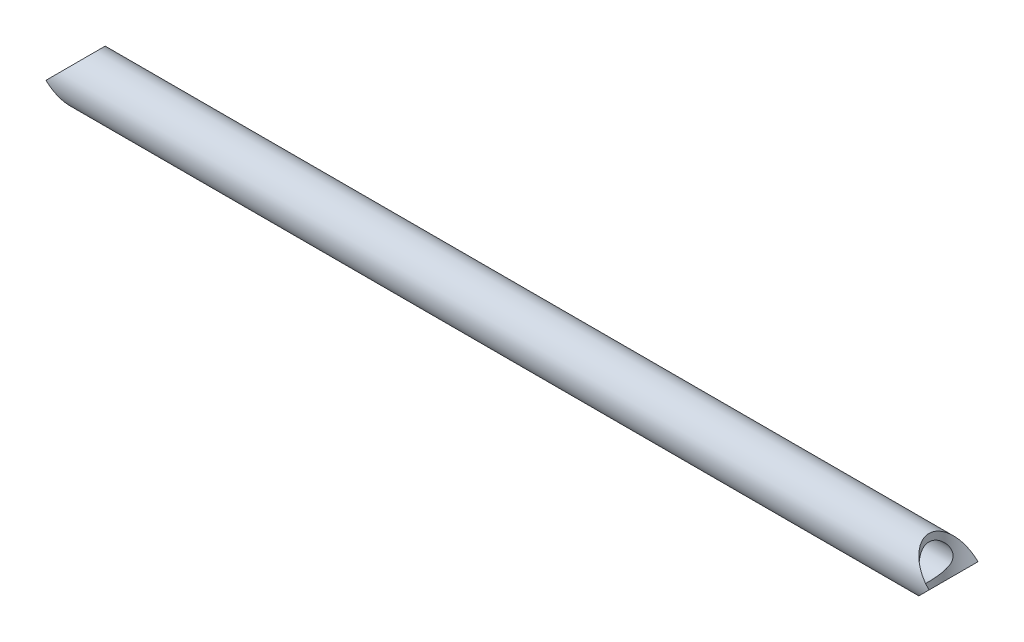
ISO-10303-21;
HEADER;
FILE_DESCRIPTION(('STEP AP214'),'2;1');
FILE_NAME('part.step','',(''),(''),'','','');
FILE_SCHEMA(('AUTOMOTIVE_DESIGN { 1 0 10303 214 1 1 1 1 }'));
ENDSEC;
DATA;
#1=APPLICATION_CONTEXT('core data for automotive mechanical design processes');
#2=APPLICATION_PROTOCOL_DEFINITION('international standard','automotive_design',2000,#1);
#3=PRODUCT_CONTEXT('',#1,'mechanical');
#4=PRODUCT('Part','Part','',(#3));
#5=PRODUCT_RELATED_PRODUCT_CATEGORY('part','',(#4));
#6=PRODUCT_DEFINITION_FORMATION('','',#4);
#7=PRODUCT_DEFINITION_CONTEXT('part definition',#1,'design');
#8=PRODUCT_DEFINITION('design','',#6,#7);
#9=PRODUCT_DEFINITION_SHAPE('','',#8);
#10=(LENGTH_UNIT() NAMED_UNIT(*) SI_UNIT(.MILLI.,.METRE.));
#11=(NAMED_UNIT(*) PLANE_ANGLE_UNIT() SI_UNIT($,.RADIAN.));
#12=(NAMED_UNIT(*) SI_UNIT($,.STERADIAN.) SOLID_ANGLE_UNIT());
#13=UNCERTAINTY_MEASURE_WITH_UNIT(LENGTH_MEASURE(1.E-05),#10,'distance_accuracy_value','');
#14=(GEOMETRIC_REPRESENTATION_CONTEXT(3) GLOBAL_UNCERTAINTY_ASSIGNED_CONTEXT((#13)) GLOBAL_UNIT_ASSIGNED_CONTEXT((#10,
#11,#12)) REPRESENTATION_CONTEXT('',''));
#15=CARTESIAN_POINT('',(0.,0.,0.));
#16=DIRECTION('',(0.,0.,1.));
#17=DIRECTION('',(1.,0.,0.));
#18=AXIS2_PLACEMENT_3D('',#15,#16,#17);
#19=CARTESIAN_POINT('',(900.,0.,-1.66533453693773E-13));
#20=DIRECTION('',(-1.,0.,0.));
#21=DIRECTION('',(0.,0.,1.));
#22=AXIS2_PLACEMENT_3D('',#19,#20,#21);
#23=CYLINDRICAL_SURFACE('',#22,35.);
#24=CARTESIAN_POINT('',(864.292857857286,0.,34.9999999999999));
#25=CARTESIAN_POINT('',(864.292849303966,-0.840107969640403,34.9999953725349));
#26=CARTESIAN_POINT('',(864.263065196487,-1.68027595587626,34.9696838888614));
#27=CARTESIAN_POINT('',(864.145552805204,-3.35221612686096,34.849181924876));
#28=CARTESIAN_POINT('',(864.057817160069,-4.1839872313608,34.7589838374223));
#29=CARTESIAN_POINT('',(863.828770631147,-5.83320919168845,34.5205642195379));
#30=CARTESIAN_POINT('',(863.687357448896,-6.65062956617839,34.3722318793914));
#31=CARTESIAN_POINT('',(863.357601126434,-8.26372825663242,34.0204719036503));
#32=CARTESIAN_POINT('',(863.169256074863,-9.05940568562161,33.8170420241068));
#33=CARTESIAN_POINT('',(862.755611040951,-10.6160962668867,33.360891138029));
#34=CARTESIAN_POINT('',(862.530752663306,-11.377399510945,33.108753050374));
#35=CARTESIAN_POINT('',(862.0501087885,-12.8722697515329,32.5567138302994));
#36=CARTESIAN_POINT('',(861.794323906225,-13.6058372991278,32.2568136474562));
#37=CARTESIAN_POINT('',(861.258988057873,-15.0436443658859,31.61185786152));
#38=CARTESIAN_POINT('',(860.979440076077,-15.7478875512387,31.2668079256175));
#39=CARTESIAN_POINT('',(860.403091712251,-17.1262102767459,30.5336264742112));
#40=CARTESIAN_POINT('',(860.106290094963,-17.8002876510772,30.1454918722867));
#41=CARTESIAN_POINT('',(859.448390250731,-19.2329409336998,29.256178437403));
#42=CARTESIAN_POINT('',(859.085135925753,-19.9856365330461,28.7471070972687));
#43=CARTESIAN_POINT('',(858.35172101799,-21.4471112794062,27.6738766652286));
#44=CARTESIAN_POINT('',(857.981559922528,-22.1558871493288,27.109713470689));
#45=CARTESIAN_POINT('',(857.241765906697,-23.5287326231606,25.9272125065642));
#46=CARTESIAN_POINT('',(856.872134115223,-24.1927488103879,25.3088119653037));
#47=CARTESIAN_POINT('',(856.141149569898,-25.4730222520026,24.0197921583747));
#48=CARTESIAN_POINT('',(855.779797389025,-26.0892762080667,23.3491692927812));
#49=CARTESIAN_POINT('',(855.013271415357,-27.3698937944522,21.8408769297572));
#50=CARTESIAN_POINT('',(854.610845068793,-28.0251298541144,20.9940046961305));
#51=CARTESIAN_POINT('',(853.837416608584,-29.261175575932,19.2338365369211));
#52=CARTESIAN_POINT('',(853.466420290707,-29.8419715212443,18.3205284178717));
#53=CARTESIAN_POINT('',(852.766866175359,-30.9214761037239,16.4329381599958));
#54=CARTESIAN_POINT('',(852.438240249569,-31.4203168818842,15.458757741131));
#55=CARTESIAN_POINT('',(851.984346648952,-32.1018921667805,13.9560498011595));
#56=CARTESIAN_POINT('',(851.839559125694,-32.317965536588,13.4482527308476));
#57=CARTESIAN_POINT('',(851.564122546055,-32.7270090161536,12.4197059332495));
#58=CARTESIAN_POINT('',(851.433472203396,-32.9199812279547,11.8989573896721));
#59=CARTESIAN_POINT('',(851.130706067753,-33.36533512942,10.6026563492036));
#60=CARTESIAN_POINT('',(850.967245562504,-33.6040865614514,9.82032326239968));
#61=CARTESIAN_POINT('',(850.676186705457,-34.0273736921218,8.23474760358157));
#62=CARTESIAN_POINT('',(850.548582014644,-34.2119189742274,7.43150875500574));
#63=CARTESIAN_POINT('',(850.331910236656,-34.5243655933765,5.80945738690208));
#64=CARTESIAN_POINT('',(850.242818426335,-34.6523032706249,4.99065521170852));
#65=CARTESIAN_POINT('',(850.105004583074,-34.8499008596341,3.34262871693422));
#66=CARTESIAN_POINT('',(850.056283920766,-34.9195587927502,2.51340404447131));
#67=CARTESIAN_POINT('',(850.000263030442,-34.9996360491842,0.849064569498191));
#68=CARTESIAN_POINT('',(849.993043859559,-35.0099394464219,0.0139414278534298));
#69=CARTESIAN_POINT('',(850.020409433773,-34.9708402171738,-1.65420898993227));
#70=CARTESIAN_POINT('',(850.054994021963,-34.9214378147871,-2.48723627392802));
#71=CARTESIAN_POINT('',(850.165188960078,-34.7636530151837,-4.14511747217371));
#72=CARTESIAN_POINT('',(850.240808856834,-34.6552568931089,-4.96996943895324));
#73=CARTESIAN_POINT('',(850.431398484374,-34.3810407659299,-6.60541848255191));
#74=CARTESIAN_POINT('',(850.546368245247,-34.2152207169174,-7.41601554847076));
#75=CARTESIAN_POINT('',(850.810141298217,-33.8328374554661,-8.99928619345022));
#76=CARTESIAN_POINT('',(850.958107900533,-33.6175256222773,-9.7724031666515));
#77=CARTESIAN_POINT('',(851.286417305621,-33.1367465419104,-11.2957516606703));
#78=CARTESIAN_POINT('',(851.466759390634,-32.8712804066381,-12.0459836884119));
#79=CARTESIAN_POINT('',(851.85659490584,-32.2929262141351,-13.5201301256892));
#80=CARTESIAN_POINT('',(852.066090310807,-31.9800349443149,-14.2440427482202));
#81=CARTESIAN_POINT('',(852.510720722347,-31.3096561009199,-15.6627291841095));
#82=CARTESIAN_POINT('',(852.74585725285,-30.9521658765087,-16.3575012621532));
#83=CARTESIAN_POINT('',(853.265729305288,-30.1528495944223,-17.7919451807379));
#84=CARTESIAN_POINT('',(853.553069735912,-29.7060614409079,-18.5279083304048));
#85=CARTESIAN_POINT('',(854.149741684263,-28.7641961243084,-19.9588293889627));
#86=CARTESIAN_POINT('',(854.459074594377,-28.2691159030151,-20.6537846964578));
#87=CARTESIAN_POINT('',(855.094731406687,-27.2332625058386,-22.0016486225771));
#88=CARTESIAN_POINT('',(855.421070908414,-26.6924470851887,-22.6545173638942));
#89=CARTESIAN_POINT('',(856.085051321791,-25.5681155096848,-23.9162202003438));
#90=CARTESIAN_POINT('',(856.422692791737,-24.9845972437002,-24.5250521154342));
#91=CARTESIAN_POINT('',(857.164546063832,-23.6690082982129,-25.802368937009));
#92=CARTESIAN_POINT('',(857.569873994199,-22.9290228122699,-26.4620778543906));
#93=CARTESIAN_POINT('',(858.378785404925,-21.3950999291498,-27.7169969188901));
#94=CARTESIAN_POINT('',(858.782368518563,-20.6011517256226,-28.3121940848648));
#95=CARTESIAN_POINT('',(859.577002944581,-18.9613586582518,-29.4356004368702));
#96=CARTESIAN_POINT('',(859.968055569932,-18.1155192589181,-29.9638166585619));
#97=CARTESIAN_POINT('',(860.725608929828,-16.373534809267,-30.9500992369554));
#98=CARTESIAN_POINT('',(861.092116812132,-15.4774045452743,-31.4081860666887));
#99=CARTESIAN_POINT('',(861.706489319342,-13.8499610572788,-32.152498402225));
#100=CARTESIAN_POINT('',(861.962172679839,-13.1285437735056,-32.4539558035033));
#101=CARTESIAN_POINT('',(862.44419636554,-11.658489952514,-33.0105609907165));
#102=CARTESIAN_POINT('',(862.670539986337,-10.9098564844763,-33.2657139790948));
#103=CARTESIAN_POINT('',(863.086380191702,-9.38878642354699,-33.7265624284369));
#104=CARTESIAN_POINT('',(863.275934419558,-8.61638930124981,-33.9323353818857));
#105=CARTESIAN_POINT('',(863.61152534719,-7.05024847858439,-34.2919745133213));
#106=CARTESIAN_POINT('',(863.757562545729,-6.2565050229873,-34.4458412862248));
#107=CARTESIAN_POINT('',(864.000998539048,-4.64420789567822,-34.7001963111162));
#108=CARTESIAN_POINT('',(864.097875426973,-3.82548200533222,-34.8001124863694));
#109=CARTESIAN_POINT('',(864.201382542916,-2.59037712675716,-34.906462732112));
#110=CARTESIAN_POINT('',(864.228917981425,-2.1774367754496,-34.9346598809065));
#111=CARTESIAN_POINT('',(864.269727339265,-1.35012910288843,-34.9763998951336));
#112=CARTESIAN_POINT('',(864.283003096413,-0.935761972428634,-34.9899446489995));
#113=CARTESIAN_POINT('',(864.295104543651,-0.106691028185782,-35.0022927186816));
#114=CARTESIAN_POINT('',(864.293933235515,0.308012697755026,-35.0010990967997));
#115=CARTESIAN_POINT('',(864.277168560676,1.13680514686356,-34.9839886104876));
#116=CARTESIAN_POINT('',(864.261575846205,1.55089389699627,-34.9680724119104));
#117=CARTESIAN_POINT('',(864.216177371149,2.37743715343424,-34.9216136308918));
#118=CARTESIAN_POINT('',(864.186372725254,2.7898917853511,-34.8910721955559));
#119=CARTESIAN_POINT('',(864.112947777708,3.61225163317417,-34.8155455653267));
#120=CARTESIAN_POINT('',(864.069326225308,4.02215661485167,-34.7705590628163));
#121=CARTESIAN_POINT('',(863.932564655998,5.132759580393,-34.6288300860581));
#122=CARTESIAN_POINT('',(863.826393073343,5.83014671179406,-34.5181524617779));
#123=CARTESIAN_POINT('',(863.57838228507,7.21081339858581,-34.2563585102617));
#124=CARTESIAN_POINT('',(863.436539900107,7.89409169057622,-34.10523857832));
#125=CARTESIAN_POINT('',(863.200329328574,8.90638582719787,-33.8496330627379));
#126=CARTESIAN_POINT('',(863.117635466747,9.24188471101659,-33.7595558421609));
#127=CARTESIAN_POINT('',(862.945040527593,9.9082557880427,-33.5700224936969));
#128=CARTESIAN_POINT('',(862.855141287184,10.2391291353681,-33.4705687550981));
#129=CARTESIAN_POINT('',(862.575448812602,11.2247039209303,-33.1584238688601));
#130=CARTESIAN_POINT('',(862.375683624423,11.8722636876035,-32.931973495484));
#131=CARTESIAN_POINT('',(861.854988357032,13.4471289901203,-32.3292847026575));
#132=CARTESIAN_POINT('',(861.52131736456,14.3624821169312,-31.9327431276928));
#133=CARTESIAN_POINT('',(860.82064804508,16.1460468025933,-31.0690795732736));
#134=CARTESIAN_POINT('',(860.453636348963,17.0142392257619,-30.6019292305054));
#135=CARTESIAN_POINT('',(859.698244859244,18.7030125712253,-29.6000468705434));
#136=CARTESIAN_POINT('',(859.309830900797,19.5235128045581,-29.0652049211537));
#137=CARTESIAN_POINT('',(858.523338645168,21.1137610555909,-27.931391233667));
#138=CARTESIAN_POINT('',(858.125261470649,21.8835149307104,-27.3324269179355));
#139=CARTESIAN_POINT('',(857.321790553093,23.3845880727686,-26.0604489027735));
#140=CARTESIAN_POINT('',(856.91640089488,24.1149044709452,-25.3862484916674));
#141=CARTESIAN_POINT('',(856.115475833858,25.5182947538455,-23.9751284614133));
#142=CARTESIAN_POINT('',(855.719941157753,26.1913644259963,-23.2382042346233));
#143=CARTESIAN_POINT('',(854.948387860112,27.4756407183393,-21.7045656028509));
#144=CARTESIAN_POINT('',(854.572344630995,28.0869263146648,-20.9079298540215));
#145=CARTESIAN_POINT('',(853.848077128021,29.2438607968108,-19.2564928275714));
#146=CARTESIAN_POINT('',(853.499847588242,29.7895221171094,-18.4017026172606));
#147=CARTESIAN_POINT('',(852.892964548996,30.7274970425655,-16.7795041914443));
#148=CARTESIAN_POINT('',(852.628917380397,31.130353940521,-16.020197937156));
#149=CARTESIAN_POINT('',(852.131362474436,31.8823772598025,-14.4657940381275));
#150=CARTESIAN_POINT('',(851.897851832563,32.2315487880222,-13.6706998070807));
#151=CARTESIAN_POINT('',(851.466165786582,32.8723150806322,-12.0486880086857));
#152=CARTESIAN_POINT('',(851.267975636753,33.1639338778232,-11.2217838975693));
#153=CARTESIAN_POINT('',(850.911132101827,33.686099501524,-9.54051455852418));
#154=CARTESIAN_POINT('',(850.752479059208,33.9166457990113,-8.68614909279153));
#155=CARTESIAN_POINT('',(850.477637159761,34.3145050274897,-6.95066907682194));
#156=CARTESIAN_POINT('',(850.36170165436,34.4814408876361,-6.06942746964139));
#157=CARTESIAN_POINT('',(850.176528789546,34.747480837529,-4.29186573010815));
#158=CARTESIAN_POINT('',(850.10729160131,34.8465846786329,-3.39554554249632));
#159=CARTESIAN_POINT('',(850.017352038809,34.9752371825238,-1.59576611558522));
#160=CARTESIAN_POINT('',(849.996634675097,35.0048073266787,-0.692309167644108));
#161=CARTESIAN_POINT('',(850.004254164555,34.9939228964912,1.11393360341855));
#162=CARTESIAN_POINT('',(850.032587332626,34.9534735826137,2.01671947185964));
#163=CARTESIAN_POINT('',(850.132439402078,34.8105711222887,3.72659142724008));
#164=CARTESIAN_POINT('',(850.199513291167,34.7144977394335,4.53448332214176));
#165=CARTESIAN_POINT('',(850.371585283382,34.4671937596204,6.13760931900881));
#166=CARTESIAN_POINT('',(850.47658048222,34.3159673866694,6.93284438545744));
#167=CARTESIAN_POINT('',(850.722354878406,33.9603123439271,8.50573152861135));
#168=CARTESIAN_POINT('',(850.863138137997,33.755877634484,9.28338159835408));
#169=CARTESIAN_POINT('',(851.177747033426,33.2962526672194,10.8166637252959));
#170=CARTESIAN_POINT('',(851.351574292506,33.0410599159516,11.5722946987337));
#171=CARTESIAN_POINT('',(851.735692555373,32.4728920278148,13.0837972709847));
#172=CARTESIAN_POINT('',(851.947044748309,32.1582105745042,13.8387561939888));
#173=CARTESIAN_POINT('',(852.397897407482,31.4805362011754,15.3178881400828));
#174=CARTESIAN_POINT('',(852.637398185755,31.1175427455969,16.0420608217759));
#175=CARTESIAN_POINT('',(853.140493194519,30.3463145406756,17.4571070426294));
#176=CARTESIAN_POINT('',(853.404087793931,29.9380790985739,18.1479800716629));
#177=CARTESIAN_POINT('',(853.951255580707,29.0791421274551,19.4946500007172));
#178=CARTESIAN_POINT('',(854.234831207913,28.6284354100836,20.15044259988));
#179=CARTESIAN_POINT('',(854.694725279239,27.885722532878,21.1564757921153));
#180=CARTESIAN_POINT('',(854.865850980707,27.6069328443119,21.5189576356896));
#181=CARTESIAN_POINT('',(855.212473816137,27.0365267034798,22.2313832619617));
#182=CARTESIAN_POINT('',(855.387970075261,26.744912809379,22.5813295202047));
#183=CARTESIAN_POINT('',(855.91986213111,25.8512679541399,23.6122700447217));
#184=CARTESIAN_POINT('',(856.281657788856,25.2304393012964,24.2743586500881));
#185=CARTESIAN_POINT('',(857.013282471479,23.9403587995707,25.5476507252637));
#186=CARTESIAN_POINT('',(857.383126061471,23.2710129671868,26.1587502186704));
#187=CARTESIAN_POINT('',(858.122832078792,21.886966502546,27.3272936639211));
#188=CARTESIAN_POINT('',(858.492694506093,21.17226349576,27.8847348028033));
#189=CARTESIAN_POINT('',(859.282134462268,19.5829695599544,29.0277545461193));
#190=CARTESIAN_POINT('',(859.700369696499,18.7009229658388,29.6039422453108));
#191=CARTESIAN_POINT('',(860.512531251659,16.8797062451458,30.678881385925));
#192=CARTESIAN_POINT('',(860.906450700122,15.9405201165734,31.1776109948959));
#193=CARTESIAN_POINT('',(861.653147942282,14.0097013727499,32.0915302946142));
#194=CARTESIAN_POINT('',(862.006025237673,13.0182044454696,32.5069238759457));
#195=CARTESIAN_POINT('',(862.653848926169,10.9845988078021,33.2491818357295));
#196=CARTESIAN_POINT('',(862.94883526119,9.94252561611588,33.5761073122505));
#197=CARTESIAN_POINT('',(863.377361196523,8.16673687167289,34.0418372383945));
#198=CARTESIAN_POINT('',(863.532034458165,7.44496965137627,34.207102988241));
#199=CARTESIAN_POINT('',(863.801800044385,5.98528009630558,34.4924486251215));
#200=CARTESIAN_POINT('',(863.916900709289,5.24736120057567,34.6125380340293));
#201=CARTESIAN_POINT('',(864.102894901818,3.76095860921778,34.8054003952498));
#202=CARTESIAN_POINT('',(864.173856144781,3.01249290688708,34.8782458330228));
#203=CARTESIAN_POINT('',(864.26884355596,1.50936797868628,34.9755498701449));
#204=CARTESIAN_POINT('',(864.292865541132,0.754708206842449,35.0000041570677));
#205=CARTESIAN_POINT('',(864.292857857286,0.,34.9999999999999));
#206=B_SPLINE_CURVE_WITH_KNOTS('',3,(#24,#25,#26,#27,#28,#29,#30,#31,#32,#33,#34,#35,#36,#37,
#38,#39,#40,#41,#42,#43,#44,#45,#46,#47,#48,#49,#50,#51,#52,#53,#54,#55,#56,#57,#58,#59,#60,#61,
#62,#63,#64,#65,#66,#67,#68,#69,#70,#71,#72,#73,#74,#75,#76,#77,#78,#79,#80,#81,#82,#83,#84,#85,
#86,#87,#88,#89,#90,#91,#92,#93,#94,#95,#96,#97,#98,#99,#100,#101,#102,#103,#104,#105,#106,#107,
#108,#109,#110,#111,#112,#113,#114,#115,#116,#117,#118,#119,#120,#121,#122,#123,#124,#125,#126,
#127,#128,#129,#130,#131,#132,#133,#134,#135,#136,#137,#138,#139,#140,#141,#142,#143,#144,#145,
#146,#147,#148,#149,#150,#151,#152,#153,#154,#155,#156,#157,#158,#159,#160,#161,#162,#163,#164,
#165,#166,#167,#168,#169,#170,#171,#172,#173,#174,#175,#176,#177,#178,#179,#180,#181,#182,#183,
#184,#185,#186,#187,#188,#189,#190,#191,#192,#193,#194,#195,#196,#197,#198,#199,#200,#201,#202,
#203,#204,#205),.UNSPECIFIED.,.T.,.F.,(4,2,2,2,2,2,2,2,2,2,2,2,2,2,2,2,2,2,2,2,2,2,2,2,2,2,2,2,
2,2,2,2,2,2,2,2,2,2,2,2,2,2,2,2,2,2,2,2,2,2,2,2,2,2,2,2,2,2,2,2,2,2,2,2,2,2,2,2,2,2,2,2,2,2,2,2,
2,2,2,2,2,2,2,2,2,2,2,2,2,2,4),(0.,2.51937866427341,5.03907741580433,7.56360250876944,
10.0882304331426,12.5843322553073,15.0803844577134,17.5761236560116,20.0720417550409,
23.0051397161625,25.9384562688946,28.875213665624,31.8121736860626,35.2391435548817,
38.6667439954377,42.0887624993613,43.7996953865139,45.5104724722833,48.0100243114239,
50.5091339717734,53.0066369505804,55.5042247182007,58.0066889059335,60.5091437009683,
63.0121809398334,65.5152200926113,67.9608365527419,70.40639880065,72.85212678561,
75.2980002070769,78.0183021621446,80.7387764986681,83.4617917237845,86.1849416595811,
89.3946103526888,92.6049237053712,95.8148995677453,99.0239365403022,101.48975503957,
103.955296324787,106.416942736103,108.878560932582,111.365792918491,112.60982351497,
113.853693758897,115.097305559003,116.340861117453,117.584319155706,118.827889787785,
120.967607439389,123.107515871967,124.178586002065,125.249383940071,127.391285251522,
130.542393968124,133.694771855559,136.852336572213,140.009536185204,143.226476554709,
146.443653442402,149.656664501507,152.869065797364,155.564040644996,158.258758970658,
160.952349647025,163.645963655054,166.355305307157,169.064656890469,171.773171351185,
174.48148233379,176.927676405827,179.373683170306,181.819967700969,184.266372433007,
186.798189652957,189.330034941575,191.861919003928,194.394112766985,195.858584269961,
197.322764954496,200.251155740817,203.185379115735,206.119756229405,209.516188906609,
212.913577176739,216.302549186755,219.689174688125,221.956212393578,224.222772004585,
226.485845800691,228.749121263825),.UNSPECIFIED.);
#207=CARTESIAN_POINT('',(864.292857857286,0.,34.9999999999999));
#208=VERTEX_POINT('',#207);
#209=EDGE_CURVE('E37',#208,#208,#206,.T.);
#210=ORIENTED_EDGE('',*,*,#209,.T.);
#211=EDGE_LOOP('',(#210));
#212=FACE_BOUND('',#211,.T.);
#213=CARTESIAN_POINT('',(-864.292857857286,0.,35.0000000000002));
#214=CARTESIAN_POINT('',(-864.292849303966,0.840107969640403,34.9999953725352));
#215=CARTESIAN_POINT('',(-864.263065196487,1.68027595587627,34.9696838888617));
#216=CARTESIAN_POINT('',(-864.145552805204,3.35221612686097,34.8491819248764));
#217=CARTESIAN_POINT('',(-864.057817160069,4.18398723136081,34.7589838374226));
#218=CARTESIAN_POINT('',(-863.828770631147,5.83320919168845,34.5205642195382));
#219=CARTESIAN_POINT('',(-863.687357448896,6.65062956617839,34.3722318793917));
#220=CARTESIAN_POINT('',(-863.357601126434,8.26372825663241,34.0204719036506));
#221=CARTESIAN_POINT('',(-863.169256074863,9.05940568562161,33.8170420241071));
#222=CARTESIAN_POINT('',(-862.755611040951,10.6160962668867,33.3608911380293));
#223=CARTESIAN_POINT('',(-862.530752663306,11.377399510945,33.1087530503743));
#224=CARTESIAN_POINT('',(-862.0501087885,12.8722697515329,32.5567138302997));
#225=CARTESIAN_POINT('',(-861.794323906225,13.6058372991277,32.2568136474565));
#226=CARTESIAN_POINT('',(-861.258988057873,15.0436443658859,31.6118578615204));
#227=CARTESIAN_POINT('',(-860.979440076077,15.7478875512387,31.2668079256179));
#228=CARTESIAN_POINT('',(-860.403091712251,17.1262102767459,30.5336264742115));
#229=CARTESIAN_POINT('',(-860.106290094963,17.8002876510772,30.145491872287));
#230=CARTESIAN_POINT('',(-859.448390250731,19.2329409336998,29.2561784374033));
#231=CARTESIAN_POINT('',(-859.085135925753,19.985636533046,28.747107097269));
#232=CARTESIAN_POINT('',(-858.35172101799,21.4471112794062,27.673876665229));
#233=CARTESIAN_POINT('',(-857.981559922528,22.1558871493288,27.1097134706893));
#234=CARTESIAN_POINT('',(-857.241765906697,23.5287326231606,25.9272125065645));
#235=CARTESIAN_POINT('',(-856.872134115223,24.1927488103879,25.308811965304));
#236=CARTESIAN_POINT('',(-856.141149569898,25.4730222520026,24.019792158375));
#237=CARTESIAN_POINT('',(-855.779797389025,26.0892762080667,23.3491692927815));
#238=CARTESIAN_POINT('',(-855.013271415357,27.3698937944522,21.8408769297576));
#239=CARTESIAN_POINT('',(-854.610845068793,28.0251298541144,20.9940046961308));
#240=CARTESIAN_POINT('',(-853.837416608584,29.261175575932,19.2338365369214));
#241=CARTESIAN_POINT('',(-853.466420290707,29.8419715212443,18.3205284178721));
#242=CARTESIAN_POINT('',(-852.766866175359,30.9214761037239,16.4329381599961));
#243=CARTESIAN_POINT('',(-852.438240249569,31.4203168818842,15.4587577411314));
#244=CARTESIAN_POINT('',(-851.984346648952,32.1018921667805,13.9560498011598));
#245=CARTESIAN_POINT('',(-851.839559125694,32.317965536588,13.4482527308479));
#246=CARTESIAN_POINT('',(-851.564122546055,32.7270090161536,12.4197059332498));
#247=CARTESIAN_POINT('',(-851.433472203396,32.9199812279547,11.8989573896724));
#248=CARTESIAN_POINT('',(-851.130706067753,33.36533512942,10.6026563492039));
#249=CARTESIAN_POINT('',(-850.967245562504,33.6040865614514,9.8203232624));
#250=CARTESIAN_POINT('',(-850.676186705457,34.0273736921218,8.2347476035819));
#251=CARTESIAN_POINT('',(-850.548582014644,34.2119189742274,7.43150875500607));
#252=CARTESIAN_POINT('',(-850.331910236656,34.5243655933765,5.80945738690241));
#253=CARTESIAN_POINT('',(-850.242818426335,34.6523032706249,4.99065521170884));
#254=CARTESIAN_POINT('',(-850.105004583074,34.8499008596341,3.34262871693455));
#255=CARTESIAN_POINT('',(-850.056283920766,34.9195587927502,2.51340404447164));
#256=CARTESIAN_POINT('',(-850.000263030442,34.9996360491842,0.849064569498528));
#257=CARTESIAN_POINT('',(-849.993043859559,35.0099394464219,0.0139414278537694));
#258=CARTESIAN_POINT('',(-850.020409433773,34.9708402171738,-1.65420898993193));
#259=CARTESIAN_POINT('',(-850.054994021963,34.9214378147871,-2.48723627392768));
#260=CARTESIAN_POINT('',(-850.165188960078,34.7636530151837,-4.14511747217336));
#261=CARTESIAN_POINT('',(-850.240808856834,34.6552568931089,-4.96996943895289));
#262=CARTESIAN_POINT('',(-850.431398484374,34.3810407659299,-6.60541848255157));
#263=CARTESIAN_POINT('',(-850.546368245247,34.2152207169174,-7.41601554847042));
#264=CARTESIAN_POINT('',(-850.810141298217,33.8328374554661,-8.99928619344988));
#265=CARTESIAN_POINT('',(-850.958107900533,33.6175256222774,-9.77240316665116));
#266=CARTESIAN_POINT('',(-851.286417305621,33.1367465419105,-11.2957516606699));
#267=CARTESIAN_POINT('',(-851.466759390634,32.8712804066381,-12.0459836884116));
#268=CARTESIAN_POINT('',(-851.85659490584,32.2929262141351,-13.5201301256889));
#269=CARTESIAN_POINT('',(-852.066090310807,31.9800349443149,-14.2440427482199));
#270=CARTESIAN_POINT('',(-852.510720722347,31.3096561009199,-15.6627291841091));
#271=CARTESIAN_POINT('',(-852.74585725285,30.9521658765087,-16.3575012621528));
#272=CARTESIAN_POINT('',(-853.265729305288,30.1528495944223,-17.7919451807375));
#273=CARTESIAN_POINT('',(-853.553069735912,29.706061440908,-18.5279083304045));
#274=CARTESIAN_POINT('',(-854.149741684263,28.7641961243084,-19.9588293889624));
#275=CARTESIAN_POINT('',(-854.459074594377,28.2691159030151,-20.6537846964575));
#276=CARTESIAN_POINT('',(-855.094731406687,27.2332625058387,-22.0016486225768));
#277=CARTESIAN_POINT('',(-855.421070908414,26.6924470851888,-22.6545173638939));
#278=CARTESIAN_POINT('',(-856.085051321791,25.5681155096848,-23.9162202003435));
#279=CARTESIAN_POINT('',(-856.422692791737,24.9845972437002,-24.5250521154339));
#280=CARTESIAN_POINT('',(-857.164546063832,23.6690082982129,-25.8023689370086));
#281=CARTESIAN_POINT('',(-857.569873994199,22.92902281227,-26.4620778543903));
#282=CARTESIAN_POINT('',(-858.378785404925,21.3950999291498,-27.7169969188898));
#283=CARTESIAN_POINT('',(-858.782368518563,20.6011517256226,-28.3121940848645));
#284=CARTESIAN_POINT('',(-859.577002944582,18.9613586582519,-29.4356004368698));
#285=CARTESIAN_POINT('',(-859.968055569932,18.1155192589181,-29.9638166585615));
#286=CARTESIAN_POINT('',(-860.725608929828,16.373534809267,-30.9500992369551));
#287=CARTESIAN_POINT('',(-861.092116812132,15.4774045452743,-31.4081860666884));
#288=CARTESIAN_POINT('',(-861.706489319342,13.8499610572788,-32.1524984022247));
#289=CARTESIAN_POINT('',(-861.962172679839,13.1285437735056,-32.4539558035029));
#290=CARTESIAN_POINT('',(-862.44419636554,11.658489952514,-33.0105609907162));
#291=CARTESIAN_POINT('',(-862.670539986337,10.9098564844762,-33.2657139790945));
#292=CARTESIAN_POINT('',(-863.086380191702,9.38878642354695,-33.7265624284366));
#293=CARTESIAN_POINT('',(-863.275934419558,8.61638930124979,-33.9323353818854));
#294=CARTESIAN_POINT('',(-863.61152534719,7.05024847858439,-34.291974513321));
#295=CARTESIAN_POINT('',(-863.757562545729,6.25650502298731,-34.4458412862245));
#296=CARTESIAN_POINT('',(-864.000998539048,4.64420789567824,-34.7001963111159));
#297=CARTESIAN_POINT('',(-864.097875426973,3.82548200533224,-34.8001124863691));
#298=CARTESIAN_POINT('',(-864.201382542916,2.59037712675719,-34.9064627321117));
#299=CARTESIAN_POINT('',(-864.228917981425,2.17743677544963,-34.9346598809062));
#300=CARTESIAN_POINT('',(-864.269727339265,1.35012910288843,-34.9763998951333));
#301=CARTESIAN_POINT('',(-864.283003096413,0.935761972428634,-34.9899446489992));
#302=CARTESIAN_POINT('',(-864.295104543651,0.106691028185773,-35.0022927186813));
#303=CARTESIAN_POINT('',(-864.293933235515,-0.308012697755035,-35.0010990967993));
#304=CARTESIAN_POINT('',(-864.277168560676,-1.13680514686357,-34.9839886104873));
#305=CARTESIAN_POINT('',(-864.261575846205,-1.55089389699628,-34.9680724119101));
#306=CARTESIAN_POINT('',(-864.216177371149,-2.37743715343424,-34.9216136308915));
#307=CARTESIAN_POINT('',(-864.186372725254,-2.7898917853511,-34.8910721955556));
#308=CARTESIAN_POINT('',(-864.112947777708,-3.61225163317417,-34.8155455653263));
#309=CARTESIAN_POINT('',(-864.069326225308,-4.02215661485167,-34.7705590628159));
#310=CARTESIAN_POINT('',(-863.932564655998,-5.132759580393,-34.6288300860578));
#311=CARTESIAN_POINT('',(-863.826393073343,-5.83014671179406,-34.5181524617776));
#312=CARTESIAN_POINT('',(-863.57838228507,-7.21081339858581,-34.2563585102614));
#313=CARTESIAN_POINT('',(-863.436539900107,-7.89409169057621,-34.1052385783197));
#314=CARTESIAN_POINT('',(-863.200329328574,-8.90638582719787,-33.8496330627376));
#315=CARTESIAN_POINT('',(-863.117635466747,-9.24188471101659,-33.7595558421606));
#316=CARTESIAN_POINT('',(-862.945040527593,-9.90825578804271,-33.5700224936965));
#317=CARTESIAN_POINT('',(-862.855141287184,-10.2391291353681,-33.4705687550977));
#318=CARTESIAN_POINT('',(-862.575448812602,-11.2247039209303,-33.1584238688597));
#319=CARTESIAN_POINT('',(-862.375683624423,-11.8722636876035,-32.9319734954836));
#320=CARTESIAN_POINT('',(-861.854988357032,-13.4471289901202,-32.3292847026572));
#321=CARTESIAN_POINT('',(-861.52131736456,-14.3624821169312,-31.9327431276925));
#322=CARTESIAN_POINT('',(-860.82064804508,-16.1460468025933,-31.0690795732733));
#323=CARTESIAN_POINT('',(-860.453636348963,-17.0142392257619,-30.6019292305051));
#324=CARTESIAN_POINT('',(-859.698244859244,-18.7030125712253,-29.6000468705431));
#325=CARTESIAN_POINT('',(-859.309830900797,-19.5235128045581,-29.0652049211534));
#326=CARTESIAN_POINT('',(-858.523338645168,-21.1137610555909,-27.9313912336666));
#327=CARTESIAN_POINT('',(-858.125261470649,-21.8835149307104,-27.3324269179352));
#328=CARTESIAN_POINT('',(-857.321790553093,-23.3845880727686,-26.0604489027731));
#329=CARTESIAN_POINT('',(-856.91640089488,-24.1149044709452,-25.3862484916671));
#330=CARTESIAN_POINT('',(-856.115475833858,-25.5182947538455,-23.975128461413));
#331=CARTESIAN_POINT('',(-855.719941157753,-26.1913644259963,-23.238204234623));
#332=CARTESIAN_POINT('',(-854.948387860112,-27.4756407183393,-21.7045656028505));
#333=CARTESIAN_POINT('',(-854.572344630995,-28.0869263146648,-20.9079298540211));
#334=CARTESIAN_POINT('',(-853.848077128021,-29.2438607968109,-19.2564928275711));
#335=CARTESIAN_POINT('',(-853.499847588242,-29.7895221171094,-18.4017026172603));
#336=CARTESIAN_POINT('',(-852.892964548996,-30.7274970425655,-16.7795041914439));
#337=CARTESIAN_POINT('',(-852.628917380397,-31.1303539405211,-16.0201979371557));
#338=CARTESIAN_POINT('',(-852.131362474436,-31.8823772598025,-14.4657940381271));
#339=CARTESIAN_POINT('',(-851.897851832563,-32.2315487880223,-13.6706998070804));
#340=CARTESIAN_POINT('',(-851.466165786582,-32.8723150806322,-12.0486880086853));
#341=CARTESIAN_POINT('',(-851.267975636753,-33.1639338778233,-11.2217838975689));
#342=CARTESIAN_POINT('',(-850.911132101827,-33.686099501524,-9.54051455852383));
#343=CARTESIAN_POINT('',(-850.752479059208,-33.9166457990114,-8.68614909279119));
#344=CARTESIAN_POINT('',(-850.477637159761,-34.3145050274897,-6.95066907682162));
#345=CARTESIAN_POINT('',(-850.36170165436,-34.4814408876361,-6.06942746964107));
#346=CARTESIAN_POINT('',(-850.176528789546,-34.747480837529,-4.29186573010782));
#347=CARTESIAN_POINT('',(-850.10729160131,-34.8465846786329,-3.39554554249597));
#348=CARTESIAN_POINT('',(-850.017352038809,-34.9752371825238,-1.59576611558486));
#349=CARTESIAN_POINT('',(-849.996634675097,-35.0048073266787,-0.692309167643753));
#350=CARTESIAN_POINT('',(-850.004254164555,-34.9939228964912,1.11393360341889));
#351=CARTESIAN_POINT('',(-850.032587332626,-34.9534735826137,2.01671947185997));
#352=CARTESIAN_POINT('',(-850.132439402078,-34.8105711222887,3.72659142724039));
#353=CARTESIAN_POINT('',(-850.199513291167,-34.7144977394336,4.53448332214207));
#354=CARTESIAN_POINT('',(-850.371585283382,-34.4671937596204,6.1376093190091));
#355=CARTESIAN_POINT('',(-850.47658048222,-34.3159673866694,6.93284438545773));
#356=CARTESIAN_POINT('',(-850.722354878406,-33.9603123439271,8.50573152861164));
#357=CARTESIAN_POINT('',(-850.863138137997,-33.755877634484,9.28338159835437));
#358=CARTESIAN_POINT('',(-851.177747033426,-33.2962526672194,10.8166637252962));
#359=CARTESIAN_POINT('',(-851.351574292506,-33.0410599159516,11.572294698734));
#360=CARTESIAN_POINT('',(-851.735692555373,-32.4728920278148,13.0837972709851));
#361=CARTESIAN_POINT('',(-851.947044748309,-32.1582105745042,13.8387561939892));
#362=CARTESIAN_POINT('',(-852.397897407482,-31.4805362011754,15.3178881400831));
#363=CARTESIAN_POINT('',(-852.637398185755,-31.1175427455969,16.0420608217762));
#364=CARTESIAN_POINT('',(-853.140493194519,-30.3463145406756,17.4571070426297));
#365=CARTESIAN_POINT('',(-853.404087793931,-29.9380790985739,18.1479800716632));
#366=CARTESIAN_POINT('',(-853.951255580707,-29.0791421274551,19.4946500007175));
#367=CARTESIAN_POINT('',(-854.234831207913,-28.6284354100836,20.1504425998803));
#368=CARTESIAN_POINT('',(-854.694725279239,-27.885722532878,21.1564757921157));
#369=CARTESIAN_POINT('',(-854.865850980707,-27.6069328443119,21.51895763569));
#370=CARTESIAN_POINT('',(-855.212473816137,-27.0365267034798,22.231383261962));
#371=CARTESIAN_POINT('',(-855.387970075261,-26.744912809379,22.581329520205));
#372=CARTESIAN_POINT('',(-855.91986213111,-25.8512679541398,23.6122700447221));
#373=CARTESIAN_POINT('',(-856.281657788856,-25.2304393012964,24.2743586500885));
#374=CARTESIAN_POINT('',(-857.013282471479,-23.9403587995707,25.5476507252641));
#375=CARTESIAN_POINT('',(-857.383126061471,-23.2710129671868,26.1587502186708));
#376=CARTESIAN_POINT('',(-858.122832078792,-21.886966502546,27.3272936639215));
#377=CARTESIAN_POINT('',(-858.492694506093,-21.17226349576,27.8847348028036));
#378=CARTESIAN_POINT('',(-859.282134462268,-19.5829695599544,29.0277545461197));
#379=CARTESIAN_POINT('',(-859.700369696499,-18.7009229658388,29.6039422453111));
#380=CARTESIAN_POINT('',(-860.512531251659,-16.8797062451458,30.6788813859253));
#381=CARTESIAN_POINT('',(-860.906450700122,-15.9405201165734,31.1776109948963));
#382=CARTESIAN_POINT('',(-861.653147942282,-14.0097013727498,32.0915302946145));
#383=CARTESIAN_POINT('',(-862.006025237673,-13.0182044454696,32.5069238759461));
#384=CARTESIAN_POINT('',(-862.653848926169,-10.9845988078021,33.2491818357298));
#385=CARTESIAN_POINT('',(-862.94883526119,-9.94252561611587,33.5761073122508));
#386=CARTESIAN_POINT('',(-863.377361196523,-8.16673687167287,34.0418372383948));
#387=CARTESIAN_POINT('',(-863.532034458165,-7.44496965137625,34.2071029882413));
#388=CARTESIAN_POINT('',(-863.801800044385,-5.98528009630558,34.4924486251218));
#389=CARTESIAN_POINT('',(-863.916900709289,-5.24736120057567,34.6125380340296));
#390=CARTESIAN_POINT('',(-864.102894901818,-3.7609586092178,34.8054003952502));
#391=CARTESIAN_POINT('',(-864.173856144781,-3.0124929068871,34.8782458330232));
#392=CARTESIAN_POINT('',(-864.268843555959,-1.5093679786863,34.9755498701452));
#393=CARTESIAN_POINT('',(-864.292865541132,-0.754708206842457,35.000004157068));
#394=CARTESIAN_POINT('',(-864.292857857286,0.,35.0000000000002));
#395=B_SPLINE_CURVE_WITH_KNOTS('',3,(#213,#214,#215,#216,#217,#218,#219,#220,#221,#222,#223,
#224,#225,#226,#227,#228,#229,#230,#231,#232,#233,#234,#235,#236,#237,#238,#239,#240,#241,#242,
#243,#244,#245,#246,#247,#248,#249,#250,#251,#252,#253,#254,#255,#256,#257,#258,#259,#260,#261,
#262,#263,#264,#265,#266,#267,#268,#269,#270,#271,#272,#273,#274,#275,#276,#277,#278,#279,#280,
#281,#282,#283,#284,#285,#286,#287,#288,#289,#290,#291,#292,#293,#294,#295,#296,#297,#298,#299,
#300,#301,#302,#303,#304,#305,#306,#307,#308,#309,#310,#311,#312,#313,#314,#315,#316,#317,#318,
#319,#320,#321,#322,#323,#324,#325,#326,#327,#328,#329,#330,#331,#332,#333,#334,#335,#336,#337,
#338,#339,#340,#341,#342,#343,#344,#345,#346,#347,#348,#349,#350,#351,#352,#353,#354,#355,#356,
#357,#358,#359,#360,#361,#362,#363,#364,#365,#366,#367,#368,#369,#370,#371,#372,#373,#374,#375,
#376,#377,#378,#379,#380,#381,#382,#383,#384,#385,#386,#387,#388,#389,#390,#391,#392,#393,#394),
.UNSPECIFIED.,.T.,.F.,(4,2,2,2,2,2,2,2,2,2,2,2,2,2,2,2,2,2,2,2,2,2,2,2,2,2,2,2,2,2,2,2,2,2,2,2,
2,2,2,2,2,2,2,2,2,2,2,2,2,2,2,2,2,2,2,2,2,2,2,2,2,2,2,2,2,2,2,2,2,2,2,2,2,2,2,2,2,2,2,2,2,2,2,2,
2,2,2,2,2,2,4),(0.,2.51937866427342,5.03907741580435,7.56360250876946,10.0882304331426,
12.5843322553073,15.0803844577134,17.5761236560116,20.0720417550408,23.0051397161625,
25.9384562688946,28.8752136656239,31.8121736860626,35.2391435548816,38.6667439954376,
42.0887624993612,43.7996953865138,45.5104724722832,48.0100243114239,50.5091339717734,
53.0066369505804,55.5042247182007,58.0066889059335,60.5091437009683,63.0121809398334,
65.5152200926113,67.9608365527419,70.4063988006499,72.8521267856099,75.2980002070769,
78.0183021621446,80.738776498668,83.4617917237845,86.1849416595811,89.3946103526887,
92.6049237053712,95.8148995677453,99.0239365403022,101.48975503957,103.955296324787,
106.416942736103,108.878560932582,111.365792918491,112.60982351497,113.853693758897,
115.097305559003,116.340861117453,117.584319155706,118.827889787785,120.967607439389,
123.107515871967,124.178586002065,125.249383940071,127.391285251522,130.542393968124,
133.694771855559,136.852336572213,140.009536185204,143.226476554709,146.443653442402,
149.656664501508,152.869065797364,155.564040644996,158.258758970658,160.952349647025,
163.645963655054,166.355305307157,169.064656890469,171.773171351185,174.48148233379,
176.927676405827,179.373683170306,181.819967700969,184.266372433007,186.798189652957,
189.330034941575,191.861919003928,194.394112766985,195.858584269961,197.322764954497,
200.251155740817,203.185379115735,206.119756229405,209.516188906609,212.913577176739,
216.302549186755,219.689174688125,221.956212393578,224.222772004585,226.485845800691,
228.749121263825),.UNSPECIFIED.);
#396=CARTESIAN_POINT('',(-864.292857857286,0.,35.0000000000002));
#397=VERTEX_POINT('',#396);
#398=EDGE_CURVE('E68',#397,#397,#395,.T.);
#399=ORIENTED_EDGE('',*,*,#398,.T.);
#400=EDGE_LOOP('',(#399));
#401=FACE_BOUND('',#400,.T.);
#402=ADVANCED_FACE('F33',(#212,#401),#23,.F.);
#403=CARTESIAN_POINT('',(-900.,-50.,1.66533453693773E-13));
#404=DIRECTION('',(0.,1.,0.));
#405=DIRECTION('',(0.,0.,1.));
#406=AXIS2_PLACEMENT_3D('',#403,#404,#405);
#407=CYLINDRICAL_SURFACE('',#406,50.);
#408=ORIENTED_EDGE('',*,*,#398,.F.);
#409=EDGE_LOOP('',(#408));
#410=FACE_BOUND('',#409,.T.);
#411=CARTESIAN_POINT('',(-900.,0.,1.66533453693773E-13));
#412=DIRECTION('',(-0.707106781186547,-0.707106781186547,0.));
#413=DIRECTION('',(-0.707106781186547,0.707106781186547,0.));
#414=AXIS2_PLACEMENT_3D('',#411,#412,#413);
#415=ELLIPSE('',#414,70.7106781186548,50.);
#416=CARTESIAN_POINT('',(-900.,0.,50.0000000000002));
#417=VERTEX_POINT('',#416);
#418=CARTESIAN_POINT('',(-900.,0.,-49.9999999999999));
#419=VERTEX_POINT('',#418);
#420=EDGE_CURVE('E65',#417,#419,#415,.F.);
#421=ORIENTED_EDGE('',*,*,#420,.F.);
#422=CARTESIAN_POINT('',(-900.,0.,1.66533453693773E-13));
#423=DIRECTION('',(-0.707106781186547,0.707106781186547,0.));
#424=DIRECTION('',(-0.707106781186547,-0.707106781186547,0.));
#425=AXIS2_PLACEMENT_3D('',#422,#423,#424);
#426=ELLIPSE('',#425,70.7106781186548,50.);
#427=EDGE_CURVE('E58',#419,#417,#426,.F.);
#428=ORIENTED_EDGE('',*,*,#427,.F.);
#429=EDGE_LOOP('',(#421,#428));
#430=FACE_BOUND('',#429,.T.);
#431=ADVANCED_FACE('F67',(#410,#430),#407,.F.);
#432=CARTESIAN_POINT('',(900.,-50.,-1.66533453693773E-13));
#433=DIRECTION('',(0.,1.,0.));
#434=DIRECTION('',(0.,0.,1.));
#435=AXIS2_PLACEMENT_3D('',#432,#433,#434);
#436=CYLINDRICAL_SURFACE('',#435,50.);
#437=ORIENTED_EDGE('',*,*,#209,.F.);
#438=EDGE_LOOP('',(#437));
#439=FACE_BOUND('',#438,.T.);
#440=CARTESIAN_POINT('',(900.,0.,-1.66533453693773E-13));
#441=DIRECTION('',(-0.707106781186547,-0.707106781186547,0.));
#442=DIRECTION('',(-0.707106781186547,0.707106781186547,0.));
#443=AXIS2_PLACEMENT_3D('',#440,#441,#442);
#444=ELLIPSE('',#443,70.7106781186548,50.);
#445=CARTESIAN_POINT('',(900.,0.,49.9999999999999));
#446=VERTEX_POINT('',#445);
#447=CARTESIAN_POINT('',(900.,0.,-50.0000000000002));
#448=VERTEX_POINT('',#447);
#449=EDGE_CURVE('E46',#446,#448,#444,.T.);
#450=ORIENTED_EDGE('',*,*,#449,.F.);
#451=CARTESIAN_POINT('',(900.,0.,-1.66533453693773E-13));
#452=DIRECTION('',(-0.707106781186547,0.707106781186547,0.));
#453=DIRECTION('',(-0.707106781186547,-0.707106781186547,0.));
#454=AXIS2_PLACEMENT_3D('',#451,#452,#453);
#455=ELLIPSE('',#454,70.7106781186548,50.);
#456=EDGE_CURVE('E11',#448,#446,#455,.T.);
#457=ORIENTED_EDGE('',*,*,#456,.F.);
#458=EDGE_LOOP('',(#450,#457));
#459=FACE_BOUND('',#458,.T.);
#460=ADVANCED_FACE('F79',(#439,#459),#436,.F.);
#461=CARTESIAN_POINT('',(900.,0.,-1.66533453693773E-13));
#462=DIRECTION('',(-1.,0.,0.));
#463=DIRECTION('',(0.,0.,1.));
#464=AXIS2_PLACEMENT_3D('',#461,#462,#463);
#465=CYLINDRICAL_SURFACE('',#464,50.);
#466=ORIENTED_EDGE('',*,*,#420,.T.);
#467=ORIENTED_EDGE('',*,*,#427,.T.);
#468=EDGE_LOOP('',(#466,#467));
#469=FACE_BOUND('',#468,.T.);
#470=ORIENTED_EDGE('',*,*,#456,.T.);
#471=ORIENTED_EDGE('',*,*,#449,.T.);
#472=EDGE_LOOP('',(#470,#471));
#473=FACE_BOUND('',#472,.T.);
#474=ADVANCED_FACE('F35',(#469,#473),#465,.T.);
#475=CLOSED_SHELL('',(#402,#431,#460,#474));
#476=MANIFOLD_SOLID_BREP('B2',#475);
#477=ADVANCED_BREP_SHAPE_REPRESENTATION('',(#18,#476),#14);
#478=SHAPE_DEFINITION_REPRESENTATION(#9,#477);
ENDSEC;
END-ISO-10303-21;
